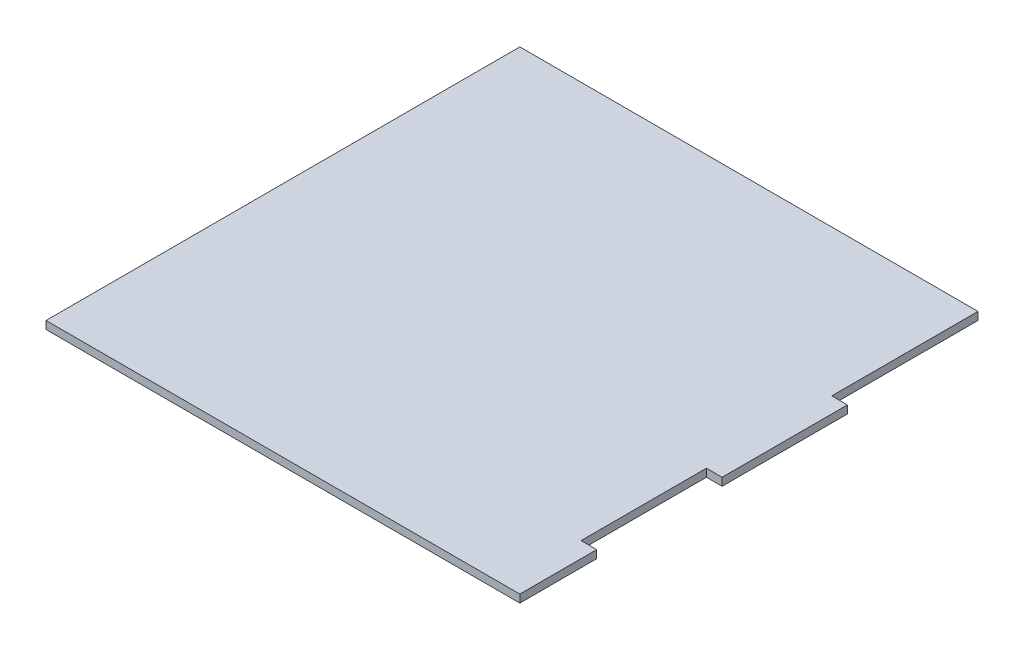
ISO-10303-21;
HEADER;
FILE_DESCRIPTION(('STEP AP214'),'2;1');
FILE_NAME('part.step','',(''),(''),'','','');
FILE_SCHEMA(('AUTOMOTIVE_DESIGN { 1 0 10303 214 1 1 1 1 }'));
ENDSEC;
DATA;
#1=APPLICATION_CONTEXT('core data for automotive mechanical design processes');
#2=APPLICATION_PROTOCOL_DEFINITION('international standard','automotive_design',2000,#1);
#3=PRODUCT_CONTEXT('',#1,'mechanical');
#4=PRODUCT('Part','Part','',(#3));
#5=PRODUCT_RELATED_PRODUCT_CATEGORY('part','',(#4));
#6=PRODUCT_DEFINITION_FORMATION('','',#4);
#7=PRODUCT_DEFINITION_CONTEXT('part definition',#1,'design');
#8=PRODUCT_DEFINITION('design','',#6,#7);
#9=PRODUCT_DEFINITION_SHAPE('','',#8);
#10=(LENGTH_UNIT() NAMED_UNIT(*) SI_UNIT(.MILLI.,.METRE.));
#11=(NAMED_UNIT(*) PLANE_ANGLE_UNIT() SI_UNIT($,.RADIAN.));
#12=(NAMED_UNIT(*) SI_UNIT($,.STERADIAN.) SOLID_ANGLE_UNIT());
#13=UNCERTAINTY_MEASURE_WITH_UNIT(LENGTH_MEASURE(1.E-05),#10,'distance_accuracy_value','');
#14=(GEOMETRIC_REPRESENTATION_CONTEXT(3) GLOBAL_UNCERTAINTY_ASSIGNED_CONTEXT((#13)) GLOBAL_UNIT_ASSIGNED_CONTEXT((#10,
#11,#12)) REPRESENTATION_CONTEXT('',''));
#15=CARTESIAN_POINT('',(0.,0.,0.));
#16=DIRECTION('',(0.,0.,1.));
#17=DIRECTION('',(1.,0.,0.));
#18=AXIS2_PLACEMENT_3D('',#15,#16,#17);
#19=CARTESIAN_POINT('',(0.,3.175,0.));
#20=DIRECTION('',(1.,0.,0.));
#21=DIRECTION('',(0.,0.,-1.));
#22=AXIS2_PLACEMENT_3D('',#19,#20,#21);
#23=PLANE('',#22);
#24=DIRECTION('',(0.,0.,1.));
#25=VECTOR('',#24,1.);
#26=CARTESIAN_POINT('',(0.,0.,0.));
#27=LINE('',#26,#25);
#28=CARTESIAN_POINT('',(0.,0.,-192.));
#29=VERTEX_POINT('',#28);
#30=CARTESIAN_POINT('',(0.,0.,0.));
#31=VERTEX_POINT('',#30);
#32=EDGE_CURVE('E141',#29,#31,#27,.T.);
#33=ORIENTED_EDGE('',*,*,#32,.T.);
#34=DIRECTION('',(0.,-1.,0.));
#35=VECTOR('',#34,1.);
#36=CARTESIAN_POINT('',(0.,3.175,0.));
#37=LINE('',#36,#35);
#38=CARTESIAN_POINT('',(0.,3.175,0.));
#39=VERTEX_POINT('',#38);
#40=EDGE_CURVE('E11',#39,#31,#37,.T.);
#41=ORIENTED_EDGE('',*,*,#40,.F.);
#42=DIRECTION('',(0.,0.,1.));
#43=VECTOR('',#42,1.);
#44=CARTESIAN_POINT('',(0.,3.175,0.));
#45=LINE('',#44,#43);
#46=CARTESIAN_POINT('',(0.,3.175,-192.));
#47=VERTEX_POINT('',#46);
#48=EDGE_CURVE('E159',#47,#39,#45,.T.);
#49=ORIENTED_EDGE('',*,*,#48,.F.);
#50=DIRECTION('',(0.,-1.,0.));
#51=VECTOR('',#50,1.);
#52=CARTESIAN_POINT('',(0.,3.175,-192.));
#53=LINE('',#52,#51);
#54=EDGE_CURVE('E137',#47,#29,#53,.T.);
#55=ORIENTED_EDGE('',*,*,#54,.T.);
#56=EDGE_LOOP('',(#33,#41,#49,#55));
#57=FACE_BOUND('',#56,.T.);
#58=ADVANCED_FACE('F33',(#57),#23,.F.);
#59=CARTESIAN_POINT('',(0.,3.175,0.));
#60=DIRECTION('',(0.,0.,-1.));
#61=DIRECTION('',(-1.,0.,0.));
#62=AXIS2_PLACEMENT_3D('',#59,#60,#61);
#63=PLANE('',#62);
#64=DIRECTION('',(1.,0.,0.));
#65=VECTOR('',#64,1.);
#66=CARTESIAN_POINT('',(0.,0.,0.));
#67=LINE('',#66,#65);
#68=CARTESIAN_POINT('',(192.,0.,0.));
#69=VERTEX_POINT('',#68);
#70=EDGE_CURVE('E144',#31,#69,#67,.T.);
#71=ORIENTED_EDGE('',*,*,#70,.T.);
#72=DIRECTION('',(0.,-1.,0.));
#73=VECTOR('',#72,1.);
#74=CARTESIAN_POINT('',(192.,3.175,0.));
#75=LINE('',#74,#73);
#76=CARTESIAN_POINT('',(192.,3.175,0.));
#77=VERTEX_POINT('',#76);
#78=EDGE_CURVE('E41',#77,#69,#75,.T.);
#79=ORIENTED_EDGE('',*,*,#78,.F.);
#80=DIRECTION('',(1.,0.,0.));
#81=VECTOR('',#80,1.);
#82=CARTESIAN_POINT('',(0.,3.175,0.));
#83=LINE('',#82,#81);
#84=EDGE_CURVE('E98',#39,#77,#83,.T.);
#85=ORIENTED_EDGE('',*,*,#84,.F.);
#86=ORIENTED_EDGE('',*,*,#40,.T.);
#87=EDGE_LOOP('',(#71,#79,#85,#86));
#88=FACE_BOUND('',#87,.T.);
#89=ADVANCED_FACE('F208',(#88),#63,.F.);
#90=CARTESIAN_POINT('',(192.,3.175,0.));
#91=DIRECTION('',(-1.,0.,0.));
#92=DIRECTION('',(0.,0.,1.));
#93=AXIS2_PLACEMENT_3D('',#90,#91,#92);
#94=PLANE('',#93);
#95=DIRECTION('',(0.,0.,-1.));
#96=VECTOR('',#95,1.);
#97=CARTESIAN_POINT('',(192.,0.,0.));
#98=LINE('',#97,#96);
#99=CARTESIAN_POINT('',(192.,0.,-31.1599726212502));
#100=VERTEX_POINT('',#99);
#101=EDGE_CURVE('E146',#69,#100,#98,.T.);
#102=ORIENTED_EDGE('',*,*,#101,.T.);
#103=DIRECTION('',(0.,-1.,0.));
#104=VECTOR('',#103,1.);
#105=CARTESIAN_POINT('',(192.,3.175,-31.1599726212502));
#106=LINE('',#105,#104);
#107=CARTESIAN_POINT('',(192.,3.175,-31.1599726212502));
#108=VERTEX_POINT('',#107);
#109=EDGE_CURVE('E172',#108,#100,#106,.T.);
#110=ORIENTED_EDGE('',*,*,#109,.F.);
#111=DIRECTION('',(0.,0.,-1.));
#112=VECTOR('',#111,1.);
#113=CARTESIAN_POINT('',(192.,3.175,0.));
#114=LINE('',#113,#112);
#115=EDGE_CURVE('E180',#77,#108,#114,.T.);
#116=ORIENTED_EDGE('',*,*,#115,.F.);
#117=ORIENTED_EDGE('',*,*,#78,.T.);
#118=EDGE_LOOP('',(#102,#110,#116,#117));
#119=FACE_BOUND('',#118,.T.);
#120=ADVANCED_FACE('F178',(#119),#94,.F.);
#121=CARTESIAN_POINT('',(192.,3.175,-31.1599726212502));
#122=DIRECTION('',(0.,0.,1.));
#123=DIRECTION('',(1.,0.,0.));
#124=AXIS2_PLACEMENT_3D('',#121,#122,#123);
#125=PLANE('',#124);
#126=DIRECTION('',(-1.,0.,0.));
#127=VECTOR('',#126,1.);
#128=CARTESIAN_POINT('',(192.,0.,-31.1599726212502));
#129=LINE('',#128,#127);
#130=CARTESIAN_POINT('',(185.65,0.,-31.1599726212502));
#131=VERTEX_POINT('',#130);
#132=EDGE_CURVE('E148',#100,#131,#129,.T.);
#133=ORIENTED_EDGE('',*,*,#132,.T.);
#134=DIRECTION('',(0.,-1.,0.));
#135=VECTOR('',#134,1.);
#136=CARTESIAN_POINT('',(185.65,3.175,-31.1599726212502));
#137=LINE('',#136,#135);
#138=CARTESIAN_POINT('',(185.65,3.175,-31.1599726212502));
#139=VERTEX_POINT('',#138);
#140=EDGE_CURVE('E169',#139,#131,#137,.T.);
#141=ORIENTED_EDGE('',*,*,#140,.F.);
#142=DIRECTION('',(-1.,0.,0.));
#143=VECTOR('',#142,1.);
#144=CARTESIAN_POINT('',(192.,3.175,-31.1599726212502));
#145=LINE('',#144,#143);
#146=EDGE_CURVE('E198',#108,#139,#145,.T.);
#147=ORIENTED_EDGE('',*,*,#146,.F.);
#148=ORIENTED_EDGE('',*,*,#109,.T.);
#149=EDGE_LOOP('',(#133,#141,#147,#148));
#150=FACE_BOUND('',#149,.T.);
#151=ADVANCED_FACE('F189',(#150),#125,.F.);
#152=CARTESIAN_POINT('',(185.65,3.175,-31.1599726212502));
#153=DIRECTION('',(-1.,0.,0.));
#154=DIRECTION('',(0.,0.,1.));
#155=AXIS2_PLACEMENT_3D('',#152,#153,#154);
#156=PLANE('',#155);
#157=DIRECTION('',(0.,0.,-1.));
#158=VECTOR('',#157,1.);
#159=CARTESIAN_POINT('',(185.65,0.,-31.1599726212502));
#160=LINE('',#159,#158);
#161=CARTESIAN_POINT('',(185.65,0.,-81.9599726212502));
#162=VERTEX_POINT('',#161);
#163=EDGE_CURVE('E150',#131,#162,#160,.T.);
#164=ORIENTED_EDGE('',*,*,#163,.T.);
#165=DIRECTION('',(0.,-1.,0.));
#166=VECTOR('',#165,1.);
#167=CARTESIAN_POINT('',(185.65,3.175,-81.9599726212502));
#168=LINE('',#167,#166);
#169=CARTESIAN_POINT('',(185.65,3.175,-81.9599726212502));
#170=VERTEX_POINT('',#169);
#171=EDGE_CURVE('E166',#170,#162,#168,.T.);
#172=ORIENTED_EDGE('',*,*,#171,.F.);
#173=DIRECTION('',(0.,0.,-1.));
#174=VECTOR('',#173,1.);
#175=CARTESIAN_POINT('',(185.65,3.175,-31.1599726212502));
#176=LINE('',#175,#174);
#177=EDGE_CURVE('E195',#139,#170,#176,.T.);
#178=ORIENTED_EDGE('',*,*,#177,.F.);
#179=ORIENTED_EDGE('',*,*,#140,.T.);
#180=EDGE_LOOP('',(#164,#172,#178,#179));
#181=FACE_BOUND('',#180,.T.);
#182=ADVANCED_FACE('F193',(#181),#156,.F.);
#183=CARTESIAN_POINT('',(192.,3.175,-81.9599726212502));
#184=DIRECTION('',(0.,0.,-1.));
#185=DIRECTION('',(-1.,0.,0.));
#186=AXIS2_PLACEMENT_3D('',#183,#184,#185);
#187=PLANE('',#186);
#188=DIRECTION('',(1.,0.,0.));
#189=VECTOR('',#188,1.);
#190=CARTESIAN_POINT('',(192.,0.,-81.9599726212502));
#191=LINE('',#190,#189);
#192=CARTESIAN_POINT('',(192.,0.,-81.9599726212502));
#193=VERTEX_POINT('',#192);
#194=EDGE_CURVE('E152',#162,#193,#191,.T.);
#195=ORIENTED_EDGE('',*,*,#194,.T.);
#196=DIRECTION('',(0.,-1.,0.));
#197=VECTOR('',#196,1.);
#198=CARTESIAN_POINT('',(192.,3.175,-81.9599726212502));
#199=LINE('',#198,#197);
#200=CARTESIAN_POINT('',(192.,3.175,-81.9599726212502));
#201=VERTEX_POINT('',#200);
#202=EDGE_CURVE('E163',#201,#193,#199,.T.);
#203=ORIENTED_EDGE('',*,*,#202,.F.);
#204=DIRECTION('',(1.,0.,0.));
#205=VECTOR('',#204,1.);
#206=CARTESIAN_POINT('',(192.,3.175,-81.9599726212502));
#207=LINE('',#206,#205);
#208=EDGE_CURVE('E197',#170,#201,#207,.T.);
#209=ORIENTED_EDGE('',*,*,#208,.F.);
#210=ORIENTED_EDGE('',*,*,#171,.T.);
#211=EDGE_LOOP('',(#195,#203,#209,#210));
#212=FACE_BOUND('',#211,.T.);
#213=ADVANCED_FACE('F220',(#212),#187,.F.);
#214=CARTESIAN_POINT('',(192.,3.175,-81.9599726212502));
#215=DIRECTION('',(-1.,0.,0.));
#216=DIRECTION('',(0.,0.,1.));
#217=AXIS2_PLACEMENT_3D('',#214,#215,#216);
#218=PLANE('',#217);
#219=DIRECTION('',(0.,0.,-1.));
#220=VECTOR('',#219,1.);
#221=CARTESIAN_POINT('',(192.,0.,-81.9599726212502));
#222=LINE('',#221,#220);
#223=CARTESIAN_POINT('',(192.,0.,-132.75997262125));
#224=VERTEX_POINT('',#223);
#225=EDGE_CURVE('E154',#193,#224,#222,.T.);
#226=ORIENTED_EDGE('',*,*,#225,.T.);
#227=DIRECTION('',(0.,-1.,0.));
#228=VECTOR('',#227,1.);
#229=CARTESIAN_POINT('',(192.,3.175,-132.75997262125));
#230=LINE('',#229,#228);
#231=CARTESIAN_POINT('',(192.,3.175,-132.75997262125));
#232=VERTEX_POINT('',#231);
#233=EDGE_CURVE('E132',#232,#224,#230,.T.);
#234=ORIENTED_EDGE('',*,*,#233,.F.);
#235=DIRECTION('',(0.,0.,-1.));
#236=VECTOR('',#235,1.);
#237=CARTESIAN_POINT('',(192.,3.175,-81.9599726212502));
#238=LINE('',#237,#236);
#239=EDGE_CURVE('E123',#201,#232,#238,.T.);
#240=ORIENTED_EDGE('',*,*,#239,.F.);
#241=ORIENTED_EDGE('',*,*,#202,.T.);
#242=EDGE_LOOP('',(#226,#234,#240,#241));
#243=FACE_BOUND('',#242,.T.);
#244=ADVANCED_FACE('F223',(#243),#218,.F.);
#245=CARTESIAN_POINT('',(192.,3.175,-132.75997262125));
#246=DIRECTION('',(0.,0.,1.));
#247=DIRECTION('',(1.,0.,0.));
#248=AXIS2_PLACEMENT_3D('',#245,#246,#247);
#249=PLANE('',#248);
#250=DIRECTION('',(-1.,0.,0.));
#251=VECTOR('',#250,1.);
#252=CARTESIAN_POINT('',(192.,0.,-132.75997262125));
#253=LINE('',#252,#251);
#254=CARTESIAN_POINT('',(185.65,0.,-132.75997262125));
#255=VERTEX_POINT('',#254);
#256=EDGE_CURVE('E131',#224,#255,#253,.T.);
#257=ORIENTED_EDGE('',*,*,#256,.T.);
#258=DIRECTION('',(0.,-1.,0.));
#259=VECTOR('',#258,1.);
#260=CARTESIAN_POINT('',(185.65,3.175,-132.75997262125));
#261=LINE('',#260,#259);
#262=CARTESIAN_POINT('',(185.65,3.175,-132.75997262125));
#263=VERTEX_POINT('',#262);
#264=EDGE_CURVE('E128',#263,#255,#261,.T.);
#265=ORIENTED_EDGE('',*,*,#264,.F.);
#266=DIRECTION('',(-1.,0.,0.));
#267=VECTOR('',#266,1.);
#268=CARTESIAN_POINT('',(192.,3.175,-132.75997262125));
#269=LINE('',#268,#267);
#270=EDGE_CURVE('E117',#232,#263,#269,.T.);
#271=ORIENTED_EDGE('',*,*,#270,.F.);
#272=ORIENTED_EDGE('',*,*,#233,.T.);
#273=EDGE_LOOP('',(#257,#265,#271,#272));
#274=FACE_BOUND('',#273,.T.);
#275=ADVANCED_FACE('F129',(#274),#249,.F.);
#276=CARTESIAN_POINT('',(185.65,3.175,-132.75997262125));
#277=DIRECTION('',(-1.,0.,0.));
#278=DIRECTION('',(0.,0.,1.));
#279=AXIS2_PLACEMENT_3D('',#276,#277,#278);
#280=PLANE('',#279);
#281=DIRECTION('',(0.,0.,-1.));
#282=VECTOR('',#281,1.);
#283=CARTESIAN_POINT('',(185.65,0.,-132.75997262125));
#284=LINE('',#283,#282);
#285=CARTESIAN_POINT('',(185.65,0.,-192.));
#286=VERTEX_POINT('',#285);
#287=EDGE_CURVE('E84',#255,#286,#284,.T.);
#288=ORIENTED_EDGE('',*,*,#287,.T.);
#289=DIRECTION('',(0.,-1.,0.));
#290=VECTOR('',#289,1.);
#291=CARTESIAN_POINT('',(185.65,3.175,-192.));
#292=LINE('',#291,#290);
#293=CARTESIAN_POINT('',(185.65,3.175,-192.));
#294=VERTEX_POINT('',#293);
#295=EDGE_CURVE('E133',#294,#286,#292,.T.);
#296=ORIENTED_EDGE('',*,*,#295,.F.);
#297=DIRECTION('',(0.,0.,-1.));
#298=VECTOR('',#297,1.);
#299=CARTESIAN_POINT('',(185.65,3.175,-132.75997262125));
#300=LINE('',#299,#298);
#301=EDGE_CURVE('E121',#263,#294,#300,.T.);
#302=ORIENTED_EDGE('',*,*,#301,.F.);
#303=ORIENTED_EDGE('',*,*,#264,.T.);
#304=EDGE_LOOP('',(#288,#296,#302,#303));
#305=FACE_BOUND('',#304,.T.);
#306=ADVANCED_FACE('F135',(#305),#280,.F.);
#307=CARTESIAN_POINT('',(0.,3.175,-192.));
#308=DIRECTION('',(0.,0.,1.));
#309=DIRECTION('',(1.,0.,0.));
#310=AXIS2_PLACEMENT_3D('',#307,#308,#309);
#311=PLANE('',#310);
#312=DIRECTION('',(-1.,0.,0.));
#313=VECTOR('',#312,1.);
#314=CARTESIAN_POINT('',(0.,0.,-192.));
#315=LINE('',#314,#313);
#316=EDGE_CURVE('E90',#286,#29,#315,.T.);
#317=ORIENTED_EDGE('',*,*,#316,.T.);
#318=ORIENTED_EDGE('',*,*,#54,.F.);
#319=DIRECTION('',(-1.,0.,0.));
#320=VECTOR('',#319,1.);
#321=CARTESIAN_POINT('',(0.,3.175,-192.));
#322=LINE('',#321,#320);
#323=EDGE_CURVE('E49',#294,#47,#322,.T.);
#324=ORIENTED_EDGE('',*,*,#323,.F.);
#325=ORIENTED_EDGE('',*,*,#295,.T.);
#326=EDGE_LOOP('',(#317,#318,#324,#325));
#327=FACE_BOUND('',#326,.T.);
#328=ADVANCED_FACE('F232',(#327),#311,.F.);
#329=CARTESIAN_POINT('',(0.,3.175,0.));
#330=DIRECTION('',(0.,-1.,0.));
#331=DIRECTION('',(0.,0.,-1.));
#332=AXIS2_PLACEMENT_3D('',#329,#330,#331);
#333=PLANE('',#332);
#334=ORIENTED_EDGE('',*,*,#48,.T.);
#335=ORIENTED_EDGE('',*,*,#84,.T.);
#336=ORIENTED_EDGE('',*,*,#115,.T.);
#337=ORIENTED_EDGE('',*,*,#146,.T.);
#338=ORIENTED_EDGE('',*,*,#177,.T.);
#339=ORIENTED_EDGE('',*,*,#208,.T.);
#340=ORIENTED_EDGE('',*,*,#239,.T.);
#341=ORIENTED_EDGE('',*,*,#270,.T.);
#342=ORIENTED_EDGE('',*,*,#301,.T.);
#343=ORIENTED_EDGE('',*,*,#323,.T.);
#344=EDGE_LOOP('',(#334,#335,#336,#337,#338,#339,#340,#341,#342,#343));
#345=FACE_BOUND('',#344,.T.);
#346=ADVANCED_FACE('F119',(#345),#333,.F.);
#347=CARTESIAN_POINT('',(0.,0.,0.));
#348=DIRECTION('',(0.,-1.,0.));
#349=DIRECTION('',(0.,0.,-1.));
#350=AXIS2_PLACEMENT_3D('',#347,#348,#349);
#351=PLANE('',#350);
#352=ORIENTED_EDGE('',*,*,#32,.F.);
#353=ORIENTED_EDGE('',*,*,#316,.F.);
#354=ORIENTED_EDGE('',*,*,#287,.F.);
#355=ORIENTED_EDGE('',*,*,#256,.F.);
#356=ORIENTED_EDGE('',*,*,#225,.F.);
#357=ORIENTED_EDGE('',*,*,#194,.F.);
#358=ORIENTED_EDGE('',*,*,#163,.F.);
#359=ORIENTED_EDGE('',*,*,#132,.F.);
#360=ORIENTED_EDGE('',*,*,#101,.F.);
#361=ORIENTED_EDGE('',*,*,#70,.F.);
#362=EDGE_LOOP('',(#352,#353,#354,#355,#356,#357,#358,#359,#360,#361));
#363=FACE_BOUND('',#362,.T.);
#364=ADVANCED_FACE('F184',(#363),#351,.T.);
#365=CLOSED_SHELL('',(#58,#89,#120,#151,#182,#213,#244,#275,#306,#328,#346,#364));
#366=MANIFOLD_SOLID_BREP('B2',#365);
#367=ADVANCED_BREP_SHAPE_REPRESENTATION('',(#18,#366),#14);
#368=SHAPE_DEFINITION_REPRESENTATION(#9,#367);
ENDSEC;
END-ISO-10303-21;
